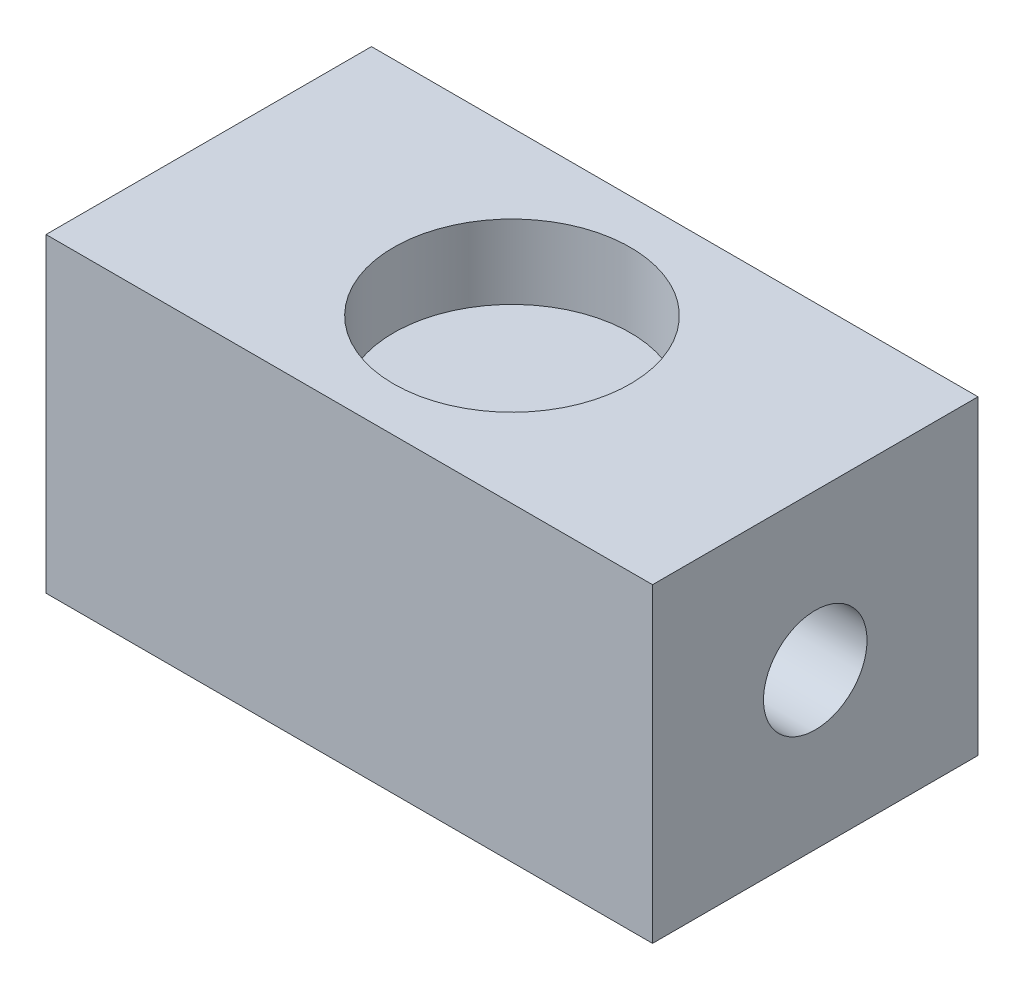
ISO-10303-21;
HEADER;
FILE_DESCRIPTION(('STEP AP214'),'2;1');
FILE_NAME('part.step','',(''),(''),'','','');
FILE_SCHEMA(('AUTOMOTIVE_DESIGN { 1 0 10303 214 1 1 1 1 }'));
ENDSEC;
DATA;
#1=APPLICATION_CONTEXT('core data for automotive mechanical design processes');
#2=APPLICATION_PROTOCOL_DEFINITION('international standard','automotive_design',2000,#1);
#3=PRODUCT_CONTEXT('',#1,'mechanical');
#4=PRODUCT('Part','Part','',(#3));
#5=PRODUCT_RELATED_PRODUCT_CATEGORY('part','',(#4));
#6=PRODUCT_DEFINITION_FORMATION('','',#4);
#7=PRODUCT_DEFINITION_CONTEXT('part definition',#1,'design');
#8=PRODUCT_DEFINITION('design','',#6,#7);
#9=PRODUCT_DEFINITION_SHAPE('','',#8);
#10=(LENGTH_UNIT() NAMED_UNIT(*) SI_UNIT(.MILLI.,.METRE.));
#11=(NAMED_UNIT(*) PLANE_ANGLE_UNIT() SI_UNIT($,.RADIAN.));
#12=(NAMED_UNIT(*) SI_UNIT($,.STERADIAN.) SOLID_ANGLE_UNIT());
#13=UNCERTAINTY_MEASURE_WITH_UNIT(LENGTH_MEASURE(1.E-05),#10,'distance_accuracy_value','');
#14=(GEOMETRIC_REPRESENTATION_CONTEXT(3) GLOBAL_UNCERTAINTY_ASSIGNED_CONTEXT((#13)) GLOBAL_UNIT_ASSIGNED_CONTEXT((#10,
#11,#12)) REPRESENTATION_CONTEXT('',''));
#15=CARTESIAN_POINT('',(0.,0.,0.));
#16=DIRECTION('',(0.,0.,1.));
#17=DIRECTION('',(1.,0.,0.));
#18=AXIS2_PLACEMENT_3D('',#15,#16,#17);
#19=CARTESIAN_POINT('',(104.14,-26.67,27.94));
#20=DIRECTION('',(0.,0.,-1.));
#21=DIRECTION('',(-1.,0.,0.));
#22=AXIS2_PLACEMENT_3D('',#19,#20,#21);
#23=PLANE('',#22);
#24=DIRECTION('',(0.,-1.,0.));
#25=VECTOR('',#24,1.);
#26=CARTESIAN_POINT('',(0.,-26.67,27.9399999999999));
#27=LINE('',#26,#25);
#28=CARTESIAN_POINT('',(0.,26.6699999999999,27.94));
#29=VERTEX_POINT('',#28);
#30=CARTESIAN_POINT('',(0.,-26.67,27.9399999999999));
#31=VERTEX_POINT('',#30);
#32=EDGE_CURVE('E95',#29,#31,#27,.T.);
#33=ORIENTED_EDGE('',*,*,#32,.T.);
#34=DIRECTION('',(-1.,0.,0.));
#35=VECTOR('',#34,1.);
#36=CARTESIAN_POINT('',(104.14,-26.67,27.94));
#37=LINE('',#36,#35);
#38=CARTESIAN_POINT('',(104.14,-26.67,27.94));
#39=VERTEX_POINT('',#38);
#40=EDGE_CURVE('E11',#39,#31,#37,.T.);
#41=ORIENTED_EDGE('',*,*,#40,.F.);
#42=DIRECTION('',(0.,-1.,0.));
#43=VECTOR('',#42,1.);
#44=CARTESIAN_POINT('',(104.14,-26.67,27.94));
#45=LINE('',#44,#43);
#46=CARTESIAN_POINT('',(104.14,26.6699999999999,27.94));
#47=VERTEX_POINT('',#46);
#48=EDGE_CURVE('E83',#47,#39,#45,.T.);
#49=ORIENTED_EDGE('',*,*,#48,.F.);
#50=DIRECTION('',(-1.,0.,0.));
#51=VECTOR('',#50,1.);
#52=CARTESIAN_POINT('',(104.14,26.6699999999999,27.94));
#53=LINE('',#52,#51);
#54=EDGE_CURVE('E91',#47,#29,#53,.T.);
#55=ORIENTED_EDGE('',*,*,#54,.T.);
#56=EDGE_LOOP('',(#33,#41,#49,#55));
#57=FACE_BOUND('',#56,.T.);
#58=ADVANCED_FACE('F32',(#57),#23,.F.);
#59=CARTESIAN_POINT('',(104.14,-26.67,-27.9400000000001));
#60=DIRECTION('',(0.,1.,0.));
#61=DIRECTION('',(0.,0.,1.));
#62=AXIS2_PLACEMENT_3D('',#59,#60,#61);
#63=PLANE('',#62);
#64=DIRECTION('',(0.,0.,-1.));
#65=VECTOR('',#64,1.);
#66=CARTESIAN_POINT('',(0.,-26.67,-27.94));
#67=LINE('',#66,#65);
#68=CARTESIAN_POINT('',(0.,-26.67,-27.94));
#69=VERTEX_POINT('',#68);
#70=EDGE_CURVE('E87',#31,#69,#67,.T.);
#71=ORIENTED_EDGE('',*,*,#70,.T.);
#72=DIRECTION('',(-1.,0.,0.));
#73=VECTOR('',#72,1.);
#74=CARTESIAN_POINT('',(104.14,-26.67,-27.9400000000001));
#75=LINE('',#74,#73);
#76=CARTESIAN_POINT('',(104.14,-26.67,-27.9400000000001));
#77=VERTEX_POINT('',#76);
#78=EDGE_CURVE('E40',#77,#69,#75,.T.);
#79=ORIENTED_EDGE('',*,*,#78,.F.);
#80=DIRECTION('',(0.,0.,-1.));
#81=VECTOR('',#80,1.);
#82=CARTESIAN_POINT('',(104.14,-26.67,-27.9400000000001));
#83=LINE('',#82,#81);
#84=EDGE_CURVE('E78',#39,#77,#83,.T.);
#85=ORIENTED_EDGE('',*,*,#84,.F.);
#86=ORIENTED_EDGE('',*,*,#40,.T.);
#87=EDGE_LOOP('',(#71,#79,#85,#86));
#88=FACE_BOUND('',#87,.T.);
#89=ADVANCED_FACE('F86',(#88),#63,.F.);
#90=CARTESIAN_POINT('',(104.14,-26.67,-27.9400000000001));
#91=DIRECTION('',(0.,0.,1.));
#92=DIRECTION('',(1.,0.,0.));
#93=AXIS2_PLACEMENT_3D('',#90,#91,#92);
#94=PLANE('',#93);
#95=DIRECTION('',(0.,1.,0.));
#96=VECTOR('',#95,1.);
#97=CARTESIAN_POINT('',(0.,-26.67,-27.94));
#98=LINE('',#97,#96);
#99=CARTESIAN_POINT('',(0.,26.6699999999999,-27.9400000000002));
#100=VERTEX_POINT('',#99);
#101=EDGE_CURVE('E65',#69,#100,#98,.T.);
#102=ORIENTED_EDGE('',*,*,#101,.T.);
#103=DIRECTION('',(-1.,0.,0.));
#104=VECTOR('',#103,1.);
#105=CARTESIAN_POINT('',(104.14,26.6699999999999,-27.9400000000001));
#106=LINE('',#105,#104);
#107=CARTESIAN_POINT('',(104.14,26.6699999999999,-27.9400000000001));
#108=VERTEX_POINT('',#107);
#109=EDGE_CURVE('E88',#108,#100,#106,.T.);
#110=ORIENTED_EDGE('',*,*,#109,.F.);
#111=DIRECTION('',(0.,1.,0.));
#112=VECTOR('',#111,1.);
#113=CARTESIAN_POINT('',(104.14,-26.67,-27.9400000000001));
#114=LINE('',#113,#112);
#115=EDGE_CURVE('E81',#77,#108,#114,.T.);
#116=ORIENTED_EDGE('',*,*,#115,.F.);
#117=ORIENTED_EDGE('',*,*,#78,.T.);
#118=EDGE_LOOP('',(#102,#110,#116,#117));
#119=FACE_BOUND('',#118,.T.);
#120=ADVANCED_FACE('F89',(#119),#94,.F.);
#121=CARTESIAN_POINT('',(104.14,26.6699999999999,-27.9400000000001));
#122=DIRECTION('',(0.,-1.,0.));
#123=DIRECTION('',(0.,0.,-1.));
#124=AXIS2_PLACEMENT_3D('',#121,#122,#123);
#125=PLANE('',#124);
#126=CARTESIAN_POINT('',(52.07,26.67,0.));
#127=DIRECTION('',(0.,1.,0.));
#128=DIRECTION('',(0.,0.,1.));
#129=AXIS2_PLACEMENT_3D('',#126,#127,#128);
#130=CIRCLE('',#129,20.32);
#131=CARTESIAN_POINT('',(52.07,26.67,20.32));
#132=VERTEX_POINT('',#131);
#133=EDGE_CURVE('E115',#132,#132,#130,.T.);
#134=ORIENTED_EDGE('',*,*,#133,.F.);
#135=EDGE_LOOP('',(#134));
#136=FACE_BOUND('',#135,.T.);
#137=DIRECTION('',(0.,0.,1.));
#138=VECTOR('',#137,1.);
#139=CARTESIAN_POINT('',(0.,26.6699999999999,-27.9400000000002));
#140=LINE('',#139,#138);
#141=EDGE_CURVE('E71',#100,#29,#140,.T.);
#142=ORIENTED_EDGE('',*,*,#141,.T.);
#143=ORIENTED_EDGE('',*,*,#54,.F.);
#144=DIRECTION('',(0.,0.,1.));
#145=VECTOR('',#144,1.);
#146=CARTESIAN_POINT('',(104.14,26.6699999999999,-27.9400000000001));
#147=LINE('',#146,#145);
#148=EDGE_CURVE('E48',#108,#47,#147,.T.);
#149=ORIENTED_EDGE('',*,*,#148,.F.);
#150=ORIENTED_EDGE('',*,*,#109,.T.);
#151=EDGE_LOOP('',(#142,#143,#149,#150));
#152=FACE_BOUND('',#151,.T.);
#153=ADVANCED_FACE('F103',(#136,#152),#125,.F.);
#154=CARTESIAN_POINT('',(104.14,0.,0.));
#155=DIRECTION('',(1.,0.,0.));
#156=DIRECTION('',(0.,0.,-1.));
#157=AXIS2_PLACEMENT_3D('',#154,#155,#156);
#158=PLANE('',#157);
#159=CARTESIAN_POINT('',(104.14,0.,0.));
#160=DIRECTION('',(1.,0.,0.));
#161=DIRECTION('',(0.,0.,-1.));
#162=AXIS2_PLACEMENT_3D('',#159,#160,#161);
#163=CIRCLE('',#162,8.89);
#164=CARTESIAN_POINT('',(104.14,0.,-8.89));
#165=VERTEX_POINT('',#164);
#166=EDGE_CURVE('E109',#165,#165,#163,.T.);
#167=ORIENTED_EDGE('',*,*,#166,.F.);
#168=EDGE_LOOP('',(#167));
#169=FACE_BOUND('',#168,.T.);
#170=ORIENTED_EDGE('',*,*,#48,.T.);
#171=ORIENTED_EDGE('',*,*,#84,.T.);
#172=ORIENTED_EDGE('',*,*,#115,.T.);
#173=ORIENTED_EDGE('',*,*,#148,.T.);
#174=EDGE_LOOP('',(#170,#171,#172,#173));
#175=FACE_BOUND('',#174,.T.);
#176=ADVANCED_FACE('F79',(#169,#175),#158,.T.);
#177=CARTESIAN_POINT('',(0.,0.,0.));
#178=DIRECTION('',(1.,0.,0.));
#179=DIRECTION('',(0.,0.,-1.));
#180=AXIS2_PLACEMENT_3D('',#177,#178,#179);
#181=PLANE('',#180);
#182=CARTESIAN_POINT('',(0.,0.,0.));
#183=DIRECTION('',(1.,0.,0.));
#184=DIRECTION('',(0.,0.,-1.));
#185=AXIS2_PLACEMENT_3D('',#182,#183,#184);
#186=CIRCLE('',#185,8.89);
#187=CARTESIAN_POINT('',(0.,0.,-8.89));
#188=VERTEX_POINT('',#187);
#189=EDGE_CURVE('E98',#188,#188,#186,.T.);
#190=ORIENTED_EDGE('',*,*,#189,.T.);
#191=EDGE_LOOP('',(#190));
#192=FACE_BOUND('',#191,.T.);
#193=ORIENTED_EDGE('',*,*,#32,.F.);
#194=ORIENTED_EDGE('',*,*,#141,.F.);
#195=ORIENTED_EDGE('',*,*,#101,.F.);
#196=ORIENTED_EDGE('',*,*,#70,.F.);
#197=EDGE_LOOP('',(#193,#194,#195,#196));
#198=FACE_BOUND('',#197,.T.);
#199=ADVANCED_FACE('F106',(#192,#198),#181,.F.);
#200=CARTESIAN_POINT('',(0.,0.,0.));
#201=DIRECTION('',(1.,0.,0.));
#202=DIRECTION('',(0.,0.,-1.));
#203=AXIS2_PLACEMENT_3D('',#200,#201,#202);
#204=CYLINDRICAL_SURFACE('',#203,8.89);
#205=ORIENTED_EDGE('',*,*,#189,.F.);
#206=EDGE_LOOP('',(#205));
#207=FACE_BOUND('',#206,.T.);
#208=ORIENTED_EDGE('',*,*,#166,.T.);
#209=EDGE_LOOP('',(#208));
#210=FACE_BOUND('',#209,.T.);
#211=ADVANCED_FACE('F126',(#207,#210),#204,.F.);
#212=CARTESIAN_POINT('',(52.07,13.97,0.));
#213=DIRECTION('',(0.,1.,0.));
#214=DIRECTION('',(0.,0.,1.));
#215=AXIS2_PLACEMENT_3D('',#212,#213,#214);
#216=CYLINDRICAL_SURFACE('',#215,20.32);
#217=CARTESIAN_POINT('',(52.07,13.97,0.));
#218=DIRECTION('',(0.,1.,0.));
#219=DIRECTION('',(0.,0.,1.));
#220=AXIS2_PLACEMENT_3D('',#217,#218,#219);
#221=CIRCLE('',#220,20.32);
#222=CARTESIAN_POINT('',(52.07,13.97,20.32));
#223=VERTEX_POINT('',#222);
#224=EDGE_CURVE('E112',#223,#223,#221,.T.);
#225=ORIENTED_EDGE('',*,*,#224,.F.);
#226=EDGE_LOOP('',(#225));
#227=FACE_BOUND('',#226,.T.);
#228=ORIENTED_EDGE('',*,*,#133,.T.);
#229=EDGE_LOOP('',(#228));
#230=FACE_BOUND('',#229,.T.);
#231=ADVANCED_FACE('F123',(#227,#230),#216,.F.);
#232=CARTESIAN_POINT('',(52.07,13.97,0.));
#233=DIRECTION('',(0.,1.,0.));
#234=DIRECTION('',(0.,0.,1.));
#235=AXIS2_PLACEMENT_3D('',#232,#233,#234);
#236=PLANE('',#235);
#237=ORIENTED_EDGE('',*,*,#224,.T.);
#238=EDGE_LOOP('',(#237));
#239=FACE_BOUND('',#238,.T.);
#240=ADVANCED_FACE('F121',(#239),#236,.T.);
#241=CLOSED_SHELL('',(#58,#89,#120,#153,#176,#199,#211,#231,#240));
#242=MANIFOLD_SOLID_BREP('B2',#241);
#243=ADVANCED_BREP_SHAPE_REPRESENTATION('',(#18,#242),#14);
#244=SHAPE_DEFINITION_REPRESENTATION(#9,#243);
ENDSEC;
END-ISO-10303-21;
